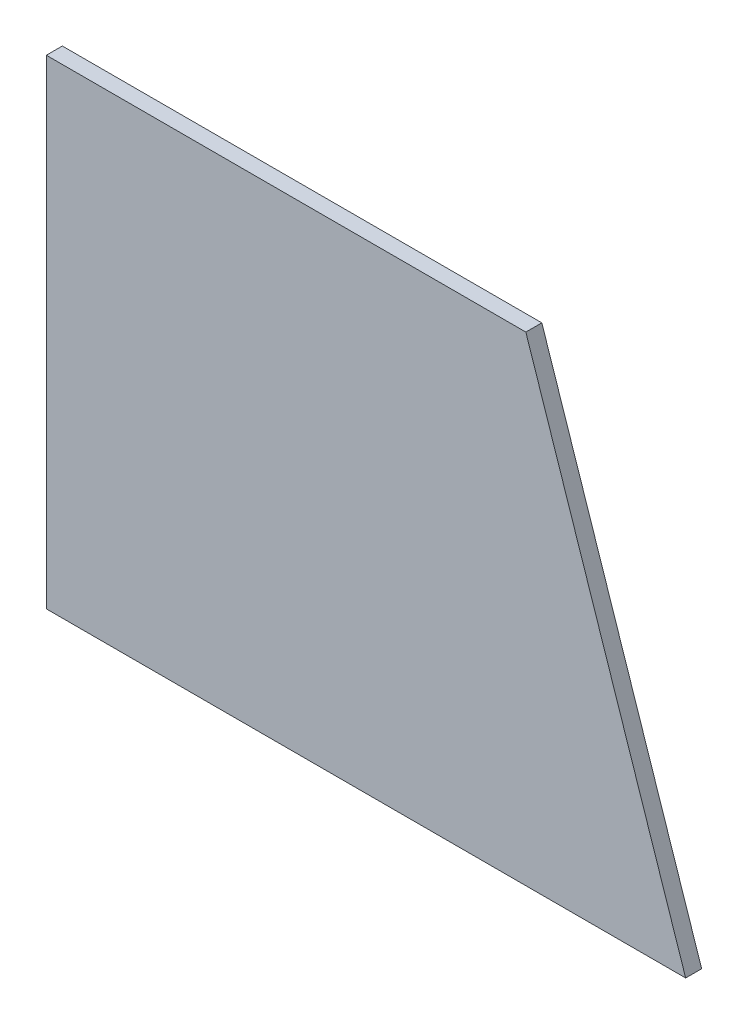
ISO-10303-21;
HEADER;
FILE_DESCRIPTION(('STEP AP214'),'2;1');
FILE_NAME('part.step','',(''),(''),'','','');
FILE_SCHEMA(('AUTOMOTIVE_DESIGN { 1 0 10303 214 1 1 1 1 }'));
ENDSEC;
DATA;
#1=APPLICATION_CONTEXT('core data for automotive mechanical design processes');
#2=APPLICATION_PROTOCOL_DEFINITION('international standard','automotive_design',2000,#1);
#3=PRODUCT_CONTEXT('',#1,'mechanical');
#4=PRODUCT('Part','Part','',(#3));
#5=PRODUCT_RELATED_PRODUCT_CATEGORY('part','',(#4));
#6=PRODUCT_DEFINITION_FORMATION('','',#4);
#7=PRODUCT_DEFINITION_CONTEXT('part definition',#1,'design');
#8=PRODUCT_DEFINITION('design','',#6,#7);
#9=PRODUCT_DEFINITION_SHAPE('','',#8);
#10=(LENGTH_UNIT() NAMED_UNIT(*) SI_UNIT(.MILLI.,.METRE.));
#11=(NAMED_UNIT(*) PLANE_ANGLE_UNIT() SI_UNIT($,.RADIAN.));
#12=(NAMED_UNIT(*) SI_UNIT($,.STERADIAN.) SOLID_ANGLE_UNIT());
#13=UNCERTAINTY_MEASURE_WITH_UNIT(LENGTH_MEASURE(1.E-05),#10,'distance_accuracy_value','');
#14=(GEOMETRIC_REPRESENTATION_CONTEXT(3) GLOBAL_UNCERTAINTY_ASSIGNED_CONTEXT((#13)) GLOBAL_UNIT_ASSIGNED_CONTEXT((#10,
#11,#12)) REPRESENTATION_CONTEXT('',''));
#15=CARTESIAN_POINT('',(0.,0.,0.));
#16=DIRECTION('',(0.,0.,1.));
#17=DIRECTION('',(1.,0.,0.));
#18=AXIS2_PLACEMENT_3D('',#15,#16,#17);
#19=CARTESIAN_POINT('',(0.6,0.6,0.01));
#20=DIRECTION('',(0.,-1.,0.));
#21=DIRECTION('',(1.,0.,0.));
#22=AXIS2_PLACEMENT_3D('',#19,#20,#21);
#23=PLANE('',#22);
#24=DIRECTION('',(-1.,0.,0.));
#25=VECTOR('',#24,1.);
#26=CARTESIAN_POINT('',(0.6,0.6,-0.01));
#27=LINE('',#26,#25);
#28=CARTESIAN_POINT('',(0.6,0.6,-0.01));
#29=VERTEX_POINT('',#28);
#30=CARTESIAN_POINT('',(0.,0.6,-0.01));
#31=VERTEX_POINT('',#30);
#32=EDGE_CURVE('E96',#29,#31,#27,.T.);
#33=ORIENTED_EDGE('',*,*,#32,.T.);
#34=DIRECTION('',(0.,0.,-1.));
#35=VECTOR('',#34,1.);
#36=CARTESIAN_POINT('',(0.,0.6,0.01));
#37=LINE('',#36,#35);
#38=CARTESIAN_POINT('',(0.,0.6,0.01));
#39=VERTEX_POINT('',#38);
#40=EDGE_CURVE('E11',#39,#31,#37,.T.);
#41=ORIENTED_EDGE('',*,*,#40,.F.);
#42=DIRECTION('',(-1.,0.,0.));
#43=VECTOR('',#42,1.);
#44=CARTESIAN_POINT('',(0.6,0.6,0.01));
#45=LINE('',#44,#43);
#46=CARTESIAN_POINT('',(0.6,0.6,0.01));
#47=VERTEX_POINT('',#46);
#48=EDGE_CURVE('E84',#47,#39,#45,.T.);
#49=ORIENTED_EDGE('',*,*,#48,.F.);
#50=DIRECTION('',(0.,0.,-1.));
#51=VECTOR('',#50,1.);
#52=CARTESIAN_POINT('',(0.6,0.6,0.01));
#53=LINE('',#52,#51);
#54=EDGE_CURVE('E92',#47,#29,#53,.T.);
#55=ORIENTED_EDGE('',*,*,#54,.T.);
#56=EDGE_LOOP('',(#33,#41,#49,#55));
#57=FACE_BOUND('',#56,.T.);
#58=ADVANCED_FACE('F33',(#57),#23,.F.);
#59=CARTESIAN_POINT('',(0.,0.6,0.01));
#60=DIRECTION('',(1.,0.,0.));
#61=DIRECTION('',(0.,0.,-1.));
#62=AXIS2_PLACEMENT_3D('',#59,#60,#61);
#63=PLANE('',#62);
#64=DIRECTION('',(0.,-1.,0.));
#65=VECTOR('',#64,1.);
#66=CARTESIAN_POINT('',(0.,0.6,-0.01));
#67=LINE('',#66,#65);
#68=CARTESIAN_POINT('',(0.,0.,-0.01));
#69=VERTEX_POINT('',#68);
#70=EDGE_CURVE('E88',#31,#69,#67,.T.);
#71=ORIENTED_EDGE('',*,*,#70,.T.);
#72=DIRECTION('',(0.,0.,-1.));
#73=VECTOR('',#72,1.);
#74=CARTESIAN_POINT('',(0.,0.,0.01));
#75=LINE('',#74,#73);
#76=CARTESIAN_POINT('',(0.,0.,0.01));
#77=VERTEX_POINT('',#76);
#78=EDGE_CURVE('E41',#77,#69,#75,.T.);
#79=ORIENTED_EDGE('',*,*,#78,.F.);
#80=DIRECTION('',(0.,-1.,0.));
#81=VECTOR('',#80,1.);
#82=CARTESIAN_POINT('',(0.,0.6,0.01));
#83=LINE('',#82,#81);
#84=EDGE_CURVE('E79',#39,#77,#83,.T.);
#85=ORIENTED_EDGE('',*,*,#84,.F.);
#86=ORIENTED_EDGE('',*,*,#40,.T.);
#87=EDGE_LOOP('',(#71,#79,#85,#86));
#88=FACE_BOUND('',#87,.T.);
#89=ADVANCED_FACE('F87',(#88),#63,.F.);
#90=CARTESIAN_POINT('',(0.,0.,0.01));
#91=DIRECTION('',(0.,1.,0.));
#92=DIRECTION('',(0.,0.,1.));
#93=AXIS2_PLACEMENT_3D('',#90,#91,#92);
#94=PLANE('',#93);
#95=DIRECTION('',(1.,0.,0.));
#96=VECTOR('',#95,1.);
#97=CARTESIAN_POINT('',(0.,0.,-0.01));
#98=LINE('',#97,#96);
#99=CARTESIAN_POINT('',(0.8,0.,-0.01));
#100=VERTEX_POINT('',#99);
#101=EDGE_CURVE('E66',#69,#100,#98,.T.);
#102=ORIENTED_EDGE('',*,*,#101,.T.);
#103=DIRECTION('',(0.,0.,-1.));
#104=VECTOR('',#103,1.);
#105=CARTESIAN_POINT('',(0.8,0.,0.01));
#106=LINE('',#105,#104);
#107=CARTESIAN_POINT('',(0.8,0.,0.01));
#108=VERTEX_POINT('',#107);
#109=EDGE_CURVE('E89',#108,#100,#106,.T.);
#110=ORIENTED_EDGE('',*,*,#109,.F.);
#111=DIRECTION('',(1.,0.,0.));
#112=VECTOR('',#111,1.);
#113=CARTESIAN_POINT('',(0.,0.,0.01));
#114=LINE('',#113,#112);
#115=EDGE_CURVE('E82',#77,#108,#114,.T.);
#116=ORIENTED_EDGE('',*,*,#115,.F.);
#117=ORIENTED_EDGE('',*,*,#78,.T.);
#118=EDGE_LOOP('',(#102,#110,#116,#117));
#119=FACE_BOUND('',#118,.T.);
#120=ADVANCED_FACE('F90',(#119),#94,.F.);
#121=CARTESIAN_POINT('',(0.8,0.,0.01));
#122=DIRECTION('',(-0.948683298050514,-0.316227766016838,0.));
#123=DIRECTION('',(0.316227766016838,-0.948683298050514,0.));
#124=AXIS2_PLACEMENT_3D('',#121,#122,#123);
#125=PLANE('',#124);
#126=DIRECTION('',(-0.316227766016838,0.948683298050514,0.));
#127=VECTOR('',#126,1.);
#128=CARTESIAN_POINT('',(0.8,0.,-0.01));
#129=LINE('',#128,#127);
#130=EDGE_CURVE('E72',#100,#29,#129,.T.);
#131=ORIENTED_EDGE('',*,*,#130,.T.);
#132=ORIENTED_EDGE('',*,*,#54,.F.);
#133=DIRECTION('',(-0.316227766016838,0.948683298050514,0.));
#134=VECTOR('',#133,1.);
#135=CARTESIAN_POINT('',(0.8,0.,0.01));
#136=LINE('',#135,#134);
#137=EDGE_CURVE('E49',#108,#47,#136,.T.);
#138=ORIENTED_EDGE('',*,*,#137,.F.);
#139=ORIENTED_EDGE('',*,*,#109,.T.);
#140=EDGE_LOOP('',(#131,#132,#138,#139));
#141=FACE_BOUND('',#140,.T.);
#142=ADVANCED_FACE('F103',(#141),#125,.F.);
#143=CARTESIAN_POINT('',(0.,0.,0.01));
#144=DIRECTION('',(0.,0.,1.));
#145=DIRECTION('',(1.,0.,0.));
#146=AXIS2_PLACEMENT_3D('',#143,#144,#145);
#147=PLANE('',#146);
#148=ORIENTED_EDGE('',*,*,#48,.T.);
#149=ORIENTED_EDGE('',*,*,#84,.T.);
#150=ORIENTED_EDGE('',*,*,#115,.T.);
#151=ORIENTED_EDGE('',*,*,#137,.T.);
#152=EDGE_LOOP('',(#148,#149,#150,#151));
#153=FACE_BOUND('',#152,.T.);
#154=ADVANCED_FACE('F80',(#153),#147,.T.);
#155=CARTESIAN_POINT('',(0.,0.,-0.01));
#156=DIRECTION('',(0.,0.,1.));
#157=DIRECTION('',(1.,0.,0.));
#158=AXIS2_PLACEMENT_3D('',#155,#156,#157);
#159=PLANE('',#158);
#160=ORIENTED_EDGE('',*,*,#32,.F.);
#161=ORIENTED_EDGE('',*,*,#130,.F.);
#162=ORIENTED_EDGE('',*,*,#101,.F.);
#163=ORIENTED_EDGE('',*,*,#70,.F.);
#164=EDGE_LOOP('',(#160,#161,#162,#163));
#165=FACE_BOUND('',#164,.T.);
#166=ADVANCED_FACE('F106',(#165),#159,.F.);
#167=CLOSED_SHELL('',(#58,#89,#120,#142,#154,#166));
#168=MANIFOLD_SOLID_BREP('B2',#167);
#169=ADVANCED_BREP_SHAPE_REPRESENTATION('',(#18,#168),#14);
#170=SHAPE_DEFINITION_REPRESENTATION(#9,#169);
ENDSEC;
END-ISO-10303-21;
